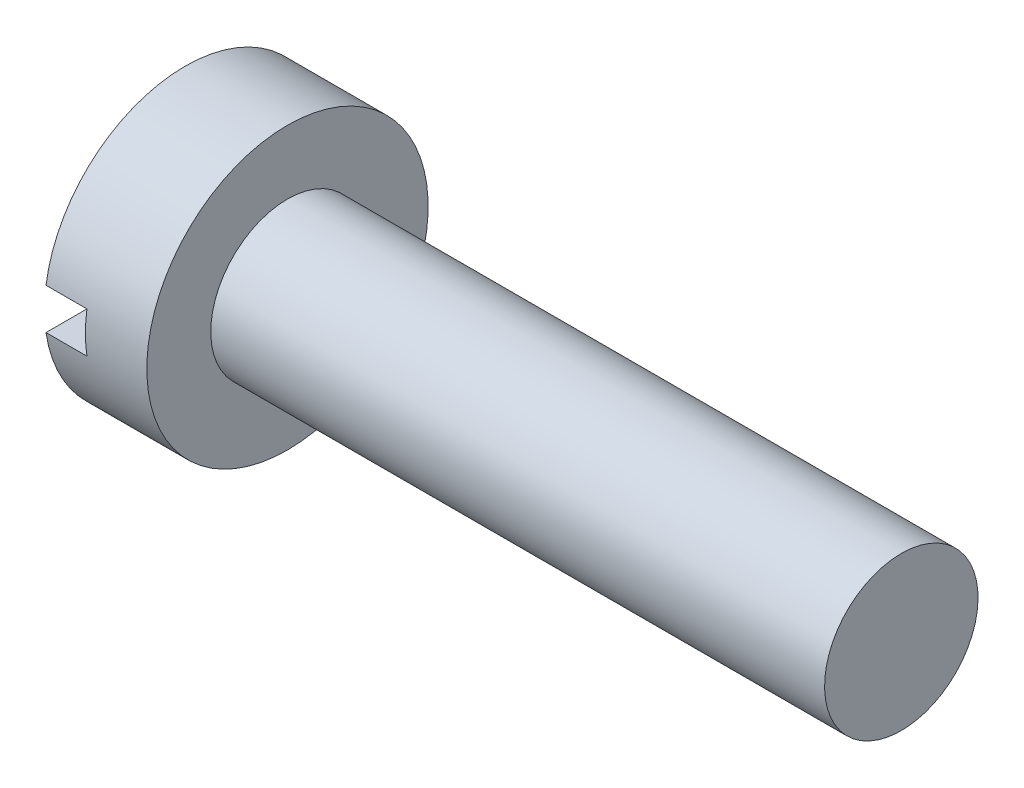
ISO-10303-21;
HEADER;
FILE_DESCRIPTION(('STEP AP214'),'2;1');
FILE_NAME('part.step','',(''),(''),'','','');
FILE_SCHEMA(('AUTOMOTIVE_DESIGN { 1 0 10303 214 1 1 1 1 }'));
ENDSEC;
DATA;
#1=APPLICATION_CONTEXT('core data for automotive mechanical design processes');
#2=APPLICATION_PROTOCOL_DEFINITION('international standard','automotive_design',2000,#1);
#3=PRODUCT_CONTEXT('',#1,'mechanical');
#4=PRODUCT('Part','Part','',(#3));
#5=PRODUCT_RELATED_PRODUCT_CATEGORY('part','',(#4));
#6=PRODUCT_DEFINITION_FORMATION('','',#4);
#7=PRODUCT_DEFINITION_CONTEXT('part definition',#1,'design');
#8=PRODUCT_DEFINITION('design','',#6,#7);
#9=PRODUCT_DEFINITION_SHAPE('','',#8);
#10=(LENGTH_UNIT() NAMED_UNIT(*) SI_UNIT(.MILLI.,.METRE.));
#11=(NAMED_UNIT(*) PLANE_ANGLE_UNIT() SI_UNIT($,.RADIAN.));
#12=(NAMED_UNIT(*) SI_UNIT($,.STERADIAN.) SOLID_ANGLE_UNIT());
#13=UNCERTAINTY_MEASURE_WITH_UNIT(LENGTH_MEASURE(1.E-05),#10,'distance_accuracy_value','');
#14=(GEOMETRIC_REPRESENTATION_CONTEXT(3) GLOBAL_UNCERTAINTY_ASSIGNED_CONTEXT((#13)) GLOBAL_UNIT_ASSIGNED_CONTEXT((#10,
#11,#12)) REPRESENTATION_CONTEXT('',''));
#15=CARTESIAN_POINT('',(0.,0.,0.));
#16=DIRECTION('',(0.,0.,1.));
#17=DIRECTION('',(1.,0.,0.));
#18=AXIS2_PLACEMENT_3D('',#15,#16,#17);
#19=CARTESIAN_POINT('',(0.,0.,0.));
#20=DIRECTION('',(-1.,0.,0.));
#21=DIRECTION('',(0.,-1.,0.));
#22=AXIS2_PLACEMENT_3D('',#19,#20,#21);
#23=PLANE('',#22);
#24=DIRECTION('',(0.,0.,-1.));
#25=VECTOR('',#24,1.);
#26=CARTESIAN_POINT('',(0.,0.399999999999997,-2.75));
#27=LINE('',#26,#25);
#28=CARTESIAN_POINT('',(0.,0.399999999999999,2.72075357208256));
#29=VERTEX_POINT('',#28);
#30=CARTESIAN_POINT('',(0.,0.399999999999997,-2.72075357208256));
#31=VERTEX_POINT('',#30);
#32=EDGE_CURVE('E83',#29,#31,#27,.T.);
#33=ORIENTED_EDGE('',*,*,#32,.F.);
#34=CARTESIAN_POINT('',(0.,0.,0.));
#35=DIRECTION('',(1.,0.,0.));
#36=DIRECTION('',(0.,1.,0.));
#37=AXIS2_PLACEMENT_3D('',#34,#35,#36);
#38=CIRCLE('',#37,2.75);
#39=EDGE_CURVE('E89',#31,#29,#38,.T.);
#40=ORIENTED_EDGE('',*,*,#39,.F.);
#41=EDGE_LOOP('',(#33,#40));
#42=FACE_BOUND('',#41,.T.);
#43=ADVANCED_FACE('F33',(#42),#23,.T.);
#44=DIRECTION('',(0.,0.,1.));
#45=VECTOR('',#44,1.);
#46=CARTESIAN_POINT('',(0.,-0.400000000000001,-2.75));
#47=LINE('',#46,#45);
#48=CARTESIAN_POINT('',(0.,-0.400000000000001,-2.72075357208256));
#49=VERTEX_POINT('',#48);
#50=CARTESIAN_POINT('',(0.,-0.399999999999999,2.72075357208256));
#51=VERTEX_POINT('',#50);
#52=EDGE_CURVE('E77',#49,#51,#47,.T.);
#53=ORIENTED_EDGE('',*,*,#52,.F.);
#54=EDGE_CURVE('E82',#51,#49,#38,.T.);
#55=ORIENTED_EDGE('',*,*,#54,.F.);
#56=EDGE_LOOP('',(#53,#55));
#57=FACE_BOUND('',#56,.T.);
#58=ADVANCED_FACE('F35',(#57),#23,.T.);
#59=CARTESIAN_POINT('',(14.,0.,0.));
#60=DIRECTION('',(1.,0.,0.));
#61=DIRECTION('',(0.,1.,0.));
#62=AXIS2_PLACEMENT_3D('',#59,#60,#61);
#63=CYLINDRICAL_SURFACE('',#62,2.75);
#64=DIRECTION('',(1.,0.,0.));
#65=VECTOR('',#64,1.);
#66=CARTESIAN_POINT('',(14.,0.399999999999997,-2.72075357208256));
#67=LINE('',#66,#65);
#68=CARTESIAN_POINT('',(0.8,0.399999999999997,-2.72075357208256));
#69=VERTEX_POINT('',#68);
#70=EDGE_CURVE('E11',#31,#69,#67,.T.);
#71=ORIENTED_EDGE('',*,*,#70,.F.);
#72=ORIENTED_EDGE('',*,*,#39,.T.);
#73=DIRECTION('',(1.,0.,0.));
#74=VECTOR('',#73,1.);
#75=CARTESIAN_POINT('',(14.,0.399999999999999,2.72075357208256));
#76=LINE('',#75,#74);
#77=CARTESIAN_POINT('',(0.8,0.399999999999999,2.72075357208256));
#78=VERTEX_POINT('',#77);
#79=EDGE_CURVE('E98',#78,#29,#76,.F.);
#80=ORIENTED_EDGE('',*,*,#79,.F.);
#81=CARTESIAN_POINT('',(0.8,0.,0.));
#82=DIRECTION('',(-1.,0.,0.));
#83=DIRECTION('',(0.,0.,1.));
#84=AXIS2_PLACEMENT_3D('',#81,#82,#83);
#85=CIRCLE('',#84,2.75);
#86=CARTESIAN_POINT('',(0.8,-0.399999999999999,2.72075357208256));
#87=VERTEX_POINT('',#86);
#88=EDGE_CURVE('E48',#78,#87,#85,.F.);
#89=ORIENTED_EDGE('',*,*,#88,.T.);
#90=DIRECTION('',(1.,0.,0.));
#91=VECTOR('',#90,1.);
#92=CARTESIAN_POINT('',(14.,-0.399999999999999,2.72075357208256));
#93=LINE('',#92,#91);
#94=EDGE_CURVE('E88',#51,#87,#93,.T.);
#95=ORIENTED_EDGE('',*,*,#94,.F.);
#96=ORIENTED_EDGE('',*,*,#54,.T.);
#97=DIRECTION('',(1.,0.,0.));
#98=VECTOR('',#97,1.);
#99=CARTESIAN_POINT('',(14.,-0.400000000000001,-2.72075357208256));
#100=LINE('',#99,#98);
#101=CARTESIAN_POINT('',(0.8,-0.400000000000001,-2.72075357208256));
#102=VERTEX_POINT('',#101);
#103=EDGE_CURVE('E41',#102,#49,#100,.F.);
#104=ORIENTED_EDGE('',*,*,#103,.F.);
#105=EDGE_CURVE('E56',#102,#69,#85,.F.);
#106=ORIENTED_EDGE('',*,*,#105,.T.);
#107=EDGE_LOOP('',(#71,#72,#80,#89,#95,#96,#104,#106));
#108=FACE_BOUND('',#107,.T.);
#109=CARTESIAN_POINT('',(2.,0.,0.));
#110=DIRECTION('',(1.,0.,0.));
#111=DIRECTION('',(0.,1.,0.));
#112=AXIS2_PLACEMENT_3D('',#109,#110,#111);
#113=CIRCLE('',#112,2.75);
#114=CARTESIAN_POINT('',(2.,2.75,0.));
#115=VERTEX_POINT('',#114);
#116=EDGE_CURVE('E93',#115,#115,#113,.T.);
#117=ORIENTED_EDGE('',*,*,#116,.F.);
#118=EDGE_LOOP('',(#117));
#119=FACE_BOUND('',#118,.T.);
#120=ADVANCED_FACE('F86',(#108,#119),#63,.T.);
#121=CARTESIAN_POINT('',(2.,2.75,0.));
#122=DIRECTION('',(1.,0.,0.));
#123=DIRECTION('',(0.,1.,0.));
#124=AXIS2_PLACEMENT_3D('',#121,#122,#123);
#125=PLANE('',#124);
#126=ORIENTED_EDGE('',*,*,#116,.T.);
#127=EDGE_LOOP('',(#126));
#128=FACE_BOUND('',#127,.T.);
#129=CARTESIAN_POINT('',(2.,0.,0.));
#130=DIRECTION('',(1.,0.,0.));
#131=DIRECTION('',(0.,1.,0.));
#132=AXIS2_PLACEMENT_3D('',#129,#130,#131);
#133=CIRCLE('',#132,1.5);
#134=CARTESIAN_POINT('',(2.,1.5,0.));
#135=VERTEX_POINT('',#134);
#136=EDGE_CURVE('E111',#135,#135,#133,.T.);
#137=ORIENTED_EDGE('',*,*,#136,.F.);
#138=EDGE_LOOP('',(#137));
#139=FACE_BOUND('',#138,.T.);
#140=ADVANCED_FACE('F118',(#128,#139),#125,.T.);
#141=CARTESIAN_POINT('',(14.,0.,0.));
#142=DIRECTION('',(1.,0.,0.));
#143=DIRECTION('',(0.,1.,0.));
#144=AXIS2_PLACEMENT_3D('',#141,#142,#143);
#145=CYLINDRICAL_SURFACE('',#144,1.5);
#146=ORIENTED_EDGE('',*,*,#136,.T.);
#147=EDGE_LOOP('',(#146));
#148=FACE_BOUND('',#147,.T.);
#149=CARTESIAN_POINT('',(14.,0.,0.));
#150=DIRECTION('',(1.,0.,0.));
#151=DIRECTION('',(0.,1.,0.));
#152=AXIS2_PLACEMENT_3D('',#149,#150,#151);
#153=CIRCLE('',#152,1.5);
#154=CARTESIAN_POINT('',(14.,1.5,0.));
#155=VERTEX_POINT('',#154);
#156=EDGE_CURVE('E109',#155,#155,#153,.T.);
#157=ORIENTED_EDGE('',*,*,#156,.F.);
#158=EDGE_LOOP('',(#157));
#159=FACE_BOUND('',#158,.T.);
#160=ADVANCED_FACE('F125',(#148,#159),#145,.T.);
#161=CARTESIAN_POINT('',(14.,1.5,0.));
#162=DIRECTION('',(1.,0.,0.));
#163=DIRECTION('',(0.,1.,0.));
#164=AXIS2_PLACEMENT_3D('',#161,#162,#163);
#165=PLANE('',#164);
#166=ORIENTED_EDGE('',*,*,#156,.T.);
#167=EDGE_LOOP('',(#166));
#168=FACE_BOUND('',#167,.T.);
#169=ADVANCED_FACE('F150',(#168),#165,.T.);
#170=CARTESIAN_POINT('',(0.8,0.399999999999997,-2.75));
#171=DIRECTION('',(0.,1.,0.));
#172=DIRECTION('',(0.,0.,1.));
#173=AXIS2_PLACEMENT_3D('',#170,#171,#172);
#174=PLANE('',#173);
#175=ORIENTED_EDGE('',*,*,#79,.T.);
#176=ORIENTED_EDGE('',*,*,#32,.T.);
#177=ORIENTED_EDGE('',*,*,#70,.T.);
#178=DIRECTION('',(0.,0.,-1.));
#179=VECTOR('',#178,1.);
#180=CARTESIAN_POINT('',(0.8,0.399999999999997,-2.75));
#181=LINE('',#180,#179);
#182=EDGE_CURVE('E105',#78,#69,#181,.T.);
#183=ORIENTED_EDGE('',*,*,#182,.F.);
#184=EDGE_LOOP('',(#175,#176,#177,#183));
#185=FACE_BOUND('',#184,.T.);
#186=ADVANCED_FACE('F145',(#185),#174,.F.);
#187=CARTESIAN_POINT('',(0.8,-0.400000000000001,-2.75));
#188=DIRECTION('',(0.,-1.,0.));
#189=DIRECTION('',(0.,0.,-1.));
#190=AXIS2_PLACEMENT_3D('',#187,#188,#189);
#191=PLANE('',#190);
#192=ORIENTED_EDGE('',*,*,#103,.T.);
#193=ORIENTED_EDGE('',*,*,#52,.T.);
#194=ORIENTED_EDGE('',*,*,#94,.T.);
#195=DIRECTION('',(0.,0.,1.));
#196=VECTOR('',#195,1.);
#197=CARTESIAN_POINT('',(0.8,-0.400000000000001,-2.75));
#198=LINE('',#197,#196);
#199=EDGE_CURVE('E78',#102,#87,#198,.T.);
#200=ORIENTED_EDGE('',*,*,#199,.F.);
#201=EDGE_LOOP('',(#192,#193,#194,#200));
#202=FACE_BOUND('',#201,.T.);
#203=ADVANCED_FACE('F76',(#202),#191,.F.);
#204=CARTESIAN_POINT('',(0.8,0.,0.));
#205=DIRECTION('',(-1.,0.,0.));
#206=DIRECTION('',(0.,0.,1.));
#207=AXIS2_PLACEMENT_3D('',#204,#205,#206);
#208=PLANE('',#207);
#209=ORIENTED_EDGE('',*,*,#199,.T.);
#210=ORIENTED_EDGE('',*,*,#88,.F.);
#211=ORIENTED_EDGE('',*,*,#182,.T.);
#212=ORIENTED_EDGE('',*,*,#105,.F.);
#213=EDGE_LOOP('',(#209,#210,#211,#212));
#214=FACE_BOUND('',#213,.T.);
#215=ADVANCED_FACE('F160',(#214),#208,.T.);
#216=CLOSED_SHELL('',(#43,#58,#120,#140,#160,#169,#186,#203,#215));
#217=MANIFOLD_SOLID_BREP('B2',#216);
#218=ADVANCED_BREP_SHAPE_REPRESENTATION('',(#18,#217),#14);
#219=SHAPE_DEFINITION_REPRESENTATION(#9,#218);
ENDSEC;
END-ISO-10303-21;
